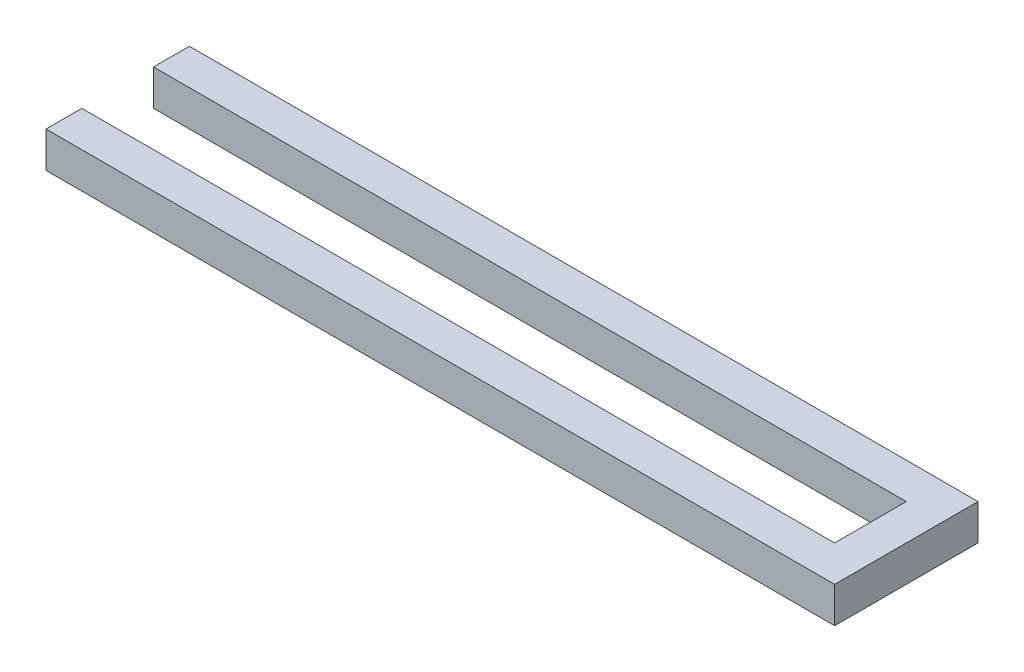
ISO-10303-21;
HEADER;
FILE_DESCRIPTION(('STEP AP214'),'2;1');
FILE_NAME('part.step','',(''),(''),'','','');
FILE_SCHEMA(('AUTOMOTIVE_DESIGN { 1 0 10303 214 1 1 1 1 }'));
ENDSEC;
DATA;
#1=APPLICATION_CONTEXT('core data for automotive mechanical design processes');
#2=APPLICATION_PROTOCOL_DEFINITION('international standard','automotive_design',2000,#1);
#3=PRODUCT_CONTEXT('',#1,'mechanical');
#4=PRODUCT('Part','Part','',(#3));
#5=PRODUCT_RELATED_PRODUCT_CATEGORY('part','',(#4));
#6=PRODUCT_DEFINITION_FORMATION('','',#4);
#7=PRODUCT_DEFINITION_CONTEXT('part definition',#1,'design');
#8=PRODUCT_DEFINITION('design','',#6,#7);
#9=PRODUCT_DEFINITION_SHAPE('','',#8);
#10=(LENGTH_UNIT() NAMED_UNIT(*) SI_UNIT(.MILLI.,.METRE.));
#11=(NAMED_UNIT(*) PLANE_ANGLE_UNIT() SI_UNIT($,.RADIAN.));
#12=(NAMED_UNIT(*) SI_UNIT($,.STERADIAN.) SOLID_ANGLE_UNIT());
#13=UNCERTAINTY_MEASURE_WITH_UNIT(LENGTH_MEASURE(1.E-05),#10,'distance_accuracy_value','');
#14=(GEOMETRIC_REPRESENTATION_CONTEXT(3) GLOBAL_UNCERTAINTY_ASSIGNED_CONTEXT((#13)) GLOBAL_UNIT_ASSIGNED_CONTEXT((#10,
#11,#12)) REPRESENTATION_CONTEXT('',''));
#15=CARTESIAN_POINT('',(0.,0.,0.));
#16=DIRECTION('',(0.,0.,1.));
#17=DIRECTION('',(1.,0.,0.));
#18=AXIS2_PLACEMENT_3D('',#15,#16,#17);
#19=CARTESIAN_POINT('',(0.,10.,19.0154264972777));
#20=DIRECTION('',(0.,0.,-1.));
#21=DIRECTION('',(-1.,0.,0.));
#22=AXIS2_PLACEMENT_3D('',#19,#20,#21);
#23=PLANE('',#22);
#24=DIRECTION('',(1.,0.,0.));
#25=VECTOR('',#24,1.);
#26=CARTESIAN_POINT('',(0.,0.,19.0154264972777));
#27=LINE('',#26,#25);
#28=CARTESIAN_POINT('',(-27.0019056261343,0.,19.0154264972777));
#29=VERTEX_POINT('',#28);
#30=CARTESIAN_POINT('',(192.998094373866,0.,19.0154264972777));
#31=VERTEX_POINT('',#30);
#32=EDGE_CURVE('E129',#29,#31,#27,.T.);
#33=ORIENTED_EDGE('',*,*,#32,.T.);
#34=DIRECTION('',(0.,-1.,0.));
#35=VECTOR('',#34,1.);
#36=CARTESIAN_POINT('',(192.998094373866,10.,19.0154264972777));
#37=LINE('',#36,#35);
#38=CARTESIAN_POINT('',(192.998094373866,10.,19.0154264972777));
#39=VERTEX_POINT('',#38);
#40=EDGE_CURVE('E11',#39,#31,#37,.T.);
#41=ORIENTED_EDGE('',*,*,#40,.F.);
#42=DIRECTION('',(1.,0.,0.));
#43=VECTOR('',#42,1.);
#44=CARTESIAN_POINT('',(0.,10.,19.0154264972777));
#45=LINE('',#44,#43);
#46=CARTESIAN_POINT('',(-27.0019056261343,10.,19.0154264972777));
#47=VERTEX_POINT('',#46);
#48=EDGE_CURVE('E87',#47,#39,#45,.T.);
#49=ORIENTED_EDGE('',*,*,#48,.F.);
#50=DIRECTION('',(0.,-1.,0.));
#51=VECTOR('',#50,1.);
#52=CARTESIAN_POINT('',(-27.0019056261343,10.,19.0154264972777));
#53=LINE('',#52,#51);
#54=EDGE_CURVE('E125',#47,#29,#53,.T.);
#55=ORIENTED_EDGE('',*,*,#54,.T.);
#56=EDGE_LOOP('',(#33,#41,#49,#55));
#57=FACE_BOUND('',#56,.T.);
#58=ADVANCED_FACE('F35',(#57),#23,.F.);
#59=CARTESIAN_POINT('',(192.998094373866,10.,0.));
#60=DIRECTION('',(1.,0.,0.));
#61=DIRECTION('',(0.,0.,-1.));
#62=AXIS2_PLACEMENT_3D('',#59,#60,#61);
#63=PLANE('',#62);
#64=DIRECTION('',(0.,0.,1.));
#65=VECTOR('',#64,1.);
#66=CARTESIAN_POINT('',(192.998094373866,0.,0.));
#67=LINE('',#66,#65);
#68=CARTESIAN_POINT('',(192.998094373866,0.,-20.9845735027223));
#69=VERTEX_POINT('',#68);
#70=EDGE_CURVE('E132',#69,#31,#67,.T.);
#71=ORIENTED_EDGE('',*,*,#70,.F.);
#72=DIRECTION('',(0.,-1.,0.));
#73=VECTOR('',#72,1.);
#74=CARTESIAN_POINT('',(192.998094373866,10.,-20.9845735027223));
#75=LINE('',#74,#73);
#76=CARTESIAN_POINT('',(192.998094373866,10.,-20.9845735027223));
#77=VERTEX_POINT('',#76);
#78=EDGE_CURVE('E43',#77,#69,#75,.T.);
#79=ORIENTED_EDGE('',*,*,#78,.F.);
#80=DIRECTION('',(0.,0.,1.));
#81=VECTOR('',#80,1.);
#82=CARTESIAN_POINT('',(192.998094373866,10.,0.));
#83=LINE('',#82,#81);
#84=EDGE_CURVE('E178',#77,#39,#83,.T.);
#85=ORIENTED_EDGE('',*,*,#84,.T.);
#86=ORIENTED_EDGE('',*,*,#40,.T.);
#87=EDGE_LOOP('',(#71,#79,#85,#86));
#88=FACE_BOUND('',#87,.T.);
#89=ADVANCED_FACE('F162',(#88),#63,.T.);
#90=CARTESIAN_POINT('',(0.,10.,-20.9845735027223));
#91=DIRECTION('',(0.,0.,-1.));
#92=DIRECTION('',(-1.,0.,0.));
#93=AXIS2_PLACEMENT_3D('',#90,#91,#92);
#94=PLANE('',#93);
#95=DIRECTION('',(1.,0.,0.));
#96=VECTOR('',#95,1.);
#97=CARTESIAN_POINT('',(0.,0.,-20.9845735027223));
#98=LINE('',#97,#96);
#99=CARTESIAN_POINT('',(-27.0019056261343,0.,-20.9845735027223));
#100=VERTEX_POINT('',#99);
#101=EDGE_CURVE('E135',#100,#69,#98,.T.);
#102=ORIENTED_EDGE('',*,*,#101,.F.);
#103=DIRECTION('',(0.,-1.,0.));
#104=VECTOR('',#103,1.);
#105=CARTESIAN_POINT('',(-27.0019056261343,10.,-20.9845735027223));
#106=LINE('',#105,#104);
#107=CARTESIAN_POINT('',(-27.0019056261343,10.,-20.9845735027223));
#108=VERTEX_POINT('',#107);
#109=EDGE_CURVE('E152',#108,#100,#106,.T.);
#110=ORIENTED_EDGE('',*,*,#109,.F.);
#111=DIRECTION('',(1.,0.,0.));
#112=VECTOR('',#111,1.);
#113=CARTESIAN_POINT('',(0.,10.,-20.9845735027223));
#114=LINE('',#113,#112);
#115=EDGE_CURVE('E159',#108,#77,#114,.T.);
#116=ORIENTED_EDGE('',*,*,#115,.T.);
#117=ORIENTED_EDGE('',*,*,#78,.T.);
#118=EDGE_LOOP('',(#102,#110,#116,#117));
#119=FACE_BOUND('',#118,.T.);
#120=ADVANCED_FACE('F157',(#119),#94,.T.);
#121=CARTESIAN_POINT('',(-27.0019056261343,10.,0.));
#122=DIRECTION('',(1.,0.,0.));
#123=DIRECTION('',(0.,0.,-1.));
#124=AXIS2_PLACEMENT_3D('',#121,#122,#123);
#125=PLANE('',#124);
#126=DIRECTION('',(0.,0.,1.));
#127=VECTOR('',#126,1.);
#128=CARTESIAN_POINT('',(-27.0019056261343,0.,0.));
#129=LINE('',#128,#127);
#130=CARTESIAN_POINT('',(-27.0019056261343,0.,-10.9845735027223));
#131=VERTEX_POINT('',#130);
#132=EDGE_CURVE('E138',#100,#131,#129,.T.);
#133=ORIENTED_EDGE('',*,*,#132,.T.);
#134=DIRECTION('',(0.,-1.,0.));
#135=VECTOR('',#134,1.);
#136=CARTESIAN_POINT('',(-27.0019056261343,10.,-10.9845735027223));
#137=LINE('',#136,#135);
#138=CARTESIAN_POINT('',(-27.0019056261343,10.,-10.9845735027223));
#139=VERTEX_POINT('',#138);
#140=EDGE_CURVE('E149',#139,#131,#137,.T.);
#141=ORIENTED_EDGE('',*,*,#140,.F.);
#142=DIRECTION('',(0.,0.,1.));
#143=VECTOR('',#142,1.);
#144=CARTESIAN_POINT('',(-27.0019056261343,10.,0.));
#145=LINE('',#144,#143);
#146=EDGE_CURVE('E174',#108,#139,#145,.T.);
#147=ORIENTED_EDGE('',*,*,#146,.F.);
#148=ORIENTED_EDGE('',*,*,#109,.T.);
#149=EDGE_LOOP('',(#133,#141,#147,#148));
#150=FACE_BOUND('',#149,.T.);
#151=ADVANCED_FACE('F170',(#150),#125,.F.);
#152=CARTESIAN_POINT('',(0.,10.,-10.9845735027223));
#153=DIRECTION('',(0.,0.,-1.));
#154=DIRECTION('',(-1.,0.,0.));
#155=AXIS2_PLACEMENT_3D('',#152,#153,#154);
#156=PLANE('',#155);
#157=DIRECTION('',(1.,0.,0.));
#158=VECTOR('',#157,1.);
#159=CARTESIAN_POINT('',(0.,0.,-10.9845735027223));
#160=LINE('',#159,#158);
#161=CARTESIAN_POINT('',(182.998094373866,0.,-10.9845735027223));
#162=VERTEX_POINT('',#161);
#163=EDGE_CURVE('E140',#131,#162,#160,.T.);
#164=ORIENTED_EDGE('',*,*,#163,.T.);
#165=DIRECTION('',(0.,-1.,0.));
#166=VECTOR('',#165,1.);
#167=CARTESIAN_POINT('',(182.998094373866,10.,-10.9845735027223));
#168=LINE('',#167,#166);
#169=CARTESIAN_POINT('',(182.998094373866,10.,-10.9845735027223));
#170=VERTEX_POINT('',#169);
#171=EDGE_CURVE('E121',#170,#162,#168,.T.);
#172=ORIENTED_EDGE('',*,*,#171,.F.);
#173=DIRECTION('',(1.,0.,0.));
#174=VECTOR('',#173,1.);
#175=CARTESIAN_POINT('',(0.,10.,-10.9845735027223));
#176=LINE('',#175,#174);
#177=EDGE_CURVE('E108',#139,#170,#176,.T.);
#178=ORIENTED_EDGE('',*,*,#177,.F.);
#179=ORIENTED_EDGE('',*,*,#140,.T.);
#180=EDGE_LOOP('',(#164,#172,#178,#179));
#181=FACE_BOUND('',#180,.T.);
#182=ADVANCED_FACE('F173',(#181),#156,.F.);
#183=CARTESIAN_POINT('',(182.998094373866,10.,0.));
#184=DIRECTION('',(1.,0.,0.));
#185=DIRECTION('',(0.,0.,-1.));
#186=AXIS2_PLACEMENT_3D('',#183,#184,#185);
#187=PLANE('',#186);
#188=DIRECTION('',(0.,0.,1.));
#189=VECTOR('',#188,1.);
#190=CARTESIAN_POINT('',(182.998094373866,0.,0.));
#191=LINE('',#190,#189);
#192=CARTESIAN_POINT('',(182.998094373866,0.,9.01542649727767));
#193=VERTEX_POINT('',#192);
#194=EDGE_CURVE('E117',#162,#193,#191,.T.);
#195=ORIENTED_EDGE('',*,*,#194,.T.);
#196=DIRECTION('',(0.,-1.,0.));
#197=VECTOR('',#196,1.);
#198=CARTESIAN_POINT('',(182.998094373866,10.,9.01542649727767));
#199=LINE('',#198,#197);
#200=CARTESIAN_POINT('',(182.998094373866,10.,9.01542649727767));
#201=VERTEX_POINT('',#200);
#202=EDGE_CURVE('E114',#201,#193,#199,.T.);
#203=ORIENTED_EDGE('',*,*,#202,.F.);
#204=DIRECTION('',(0.,0.,1.));
#205=VECTOR('',#204,1.);
#206=CARTESIAN_POINT('',(182.998094373866,10.,0.));
#207=LINE('',#206,#205);
#208=EDGE_CURVE('E102',#170,#201,#207,.T.);
#209=ORIENTED_EDGE('',*,*,#208,.F.);
#210=ORIENTED_EDGE('',*,*,#171,.T.);
#211=EDGE_LOOP('',(#195,#203,#209,#210));
#212=FACE_BOUND('',#211,.T.);
#213=ADVANCED_FACE('F115',(#212),#187,.F.);
#214=CARTESIAN_POINT('',(0.,10.,9.01542649727767));
#215=DIRECTION('',(0.,0.,-1.));
#216=DIRECTION('',(-1.,0.,0.));
#217=AXIS2_PLACEMENT_3D('',#214,#215,#216);
#218=PLANE('',#217);
#219=DIRECTION('',(1.,0.,0.));
#220=VECTOR('',#219,1.);
#221=CARTESIAN_POINT('',(0.,0.,9.01542649727767));
#222=LINE('',#221,#220);
#223=CARTESIAN_POINT('',(-27.0019056261343,0.,9.01542649727767));
#224=VERTEX_POINT('',#223);
#225=EDGE_CURVE('E143',#224,#193,#222,.T.);
#226=ORIENTED_EDGE('',*,*,#225,.F.);
#227=DIRECTION('',(0.,-1.,0.));
#228=VECTOR('',#227,1.);
#229=CARTESIAN_POINT('',(-27.0019056261343,10.,9.01542649727767));
#230=LINE('',#229,#228);
#231=CARTESIAN_POINT('',(-27.0019056261343,10.,9.01542649727767));
#232=VERTEX_POINT('',#231);
#233=EDGE_CURVE('E78',#232,#224,#230,.T.);
#234=ORIENTED_EDGE('',*,*,#233,.F.);
#235=DIRECTION('',(1.,0.,0.));
#236=VECTOR('',#235,1.);
#237=CARTESIAN_POINT('',(0.,10.,9.01542649727767));
#238=LINE('',#237,#236);
#239=EDGE_CURVE('E106',#232,#201,#238,.T.);
#240=ORIENTED_EDGE('',*,*,#239,.T.);
#241=ORIENTED_EDGE('',*,*,#202,.T.);
#242=EDGE_LOOP('',(#226,#234,#240,#241));
#243=FACE_BOUND('',#242,.T.);
#244=ADVANCED_FACE('F123',(#243),#218,.T.);
#245=CARTESIAN_POINT('',(-27.0019056261343,10.,0.));
#246=DIRECTION('',(1.,0.,0.));
#247=DIRECTION('',(0.,0.,-1.));
#248=AXIS2_PLACEMENT_3D('',#245,#246,#247);
#249=PLANE('',#248);
#250=DIRECTION('',(0.,0.,1.));
#251=VECTOR('',#250,1.);
#252=CARTESIAN_POINT('',(-27.0019056261343,0.,0.));
#253=LINE('',#252,#251);
#254=EDGE_CURVE('E81',#224,#29,#253,.T.);
#255=ORIENTED_EDGE('',*,*,#254,.T.);
#256=ORIENTED_EDGE('',*,*,#54,.F.);
#257=DIRECTION('',(0.,0.,1.));
#258=VECTOR('',#257,1.);
#259=CARTESIAN_POINT('',(-27.0019056261343,10.,0.));
#260=LINE('',#259,#258);
#261=EDGE_CURVE('E51',#232,#47,#260,.T.);
#262=ORIENTED_EDGE('',*,*,#261,.F.);
#263=ORIENTED_EDGE('',*,*,#233,.T.);
#264=EDGE_LOOP('',(#255,#256,#262,#263));
#265=FACE_BOUND('',#264,.T.);
#266=ADVANCED_FACE('F181',(#265),#249,.F.);
#267=CARTESIAN_POINT('',(0.,10.,0.));
#268=DIRECTION('',(0.,1.,0.));
#269=DIRECTION('',(0.,0.,1.));
#270=AXIS2_PLACEMENT_3D('',#267,#268,#269);
#271=PLANE('',#270);
#272=ORIENTED_EDGE('',*,*,#48,.T.);
#273=ORIENTED_EDGE('',*,*,#84,.F.);
#274=ORIENTED_EDGE('',*,*,#115,.F.);
#275=ORIENTED_EDGE('',*,*,#146,.T.);
#276=ORIENTED_EDGE('',*,*,#177,.T.);
#277=ORIENTED_EDGE('',*,*,#208,.T.);
#278=ORIENTED_EDGE('',*,*,#239,.F.);
#279=ORIENTED_EDGE('',*,*,#261,.T.);
#280=EDGE_LOOP('',(#272,#273,#274,#275,#276,#277,#278,#279));
#281=FACE_BOUND('',#280,.T.);
#282=ADVANCED_FACE('F104',(#281),#271,.T.);
#283=CARTESIAN_POINT('',(0.,0.,0.));
#284=DIRECTION('',(0.,1.,0.));
#285=DIRECTION('',(0.,0.,1.));
#286=AXIS2_PLACEMENT_3D('',#283,#284,#285);
#287=PLANE('',#286);
#288=ORIENTED_EDGE('',*,*,#32,.F.);
#289=ORIENTED_EDGE('',*,*,#254,.F.);
#290=ORIENTED_EDGE('',*,*,#225,.T.);
#291=ORIENTED_EDGE('',*,*,#194,.F.);
#292=ORIENTED_EDGE('',*,*,#163,.F.);
#293=ORIENTED_EDGE('',*,*,#132,.F.);
#294=ORIENTED_EDGE('',*,*,#101,.T.);
#295=ORIENTED_EDGE('',*,*,#70,.T.);
#296=EDGE_LOOP('',(#288,#289,#290,#291,#292,#293,#294,#295));
#297=FACE_BOUND('',#296,.T.);
#298=ADVANCED_FACE('F166',(#297),#287,.F.);
#299=CLOSED_SHELL('',(#58,#89,#120,#151,#182,#213,#244,#266,#282,#298));
#300=MANIFOLD_SOLID_BREP('B2',#299);
#301=ADVANCED_BREP_SHAPE_REPRESENTATION('',(#18,#300),#14);
#302=SHAPE_DEFINITION_REPRESENTATION(#9,#301);
ENDSEC;
END-ISO-10303-21;
